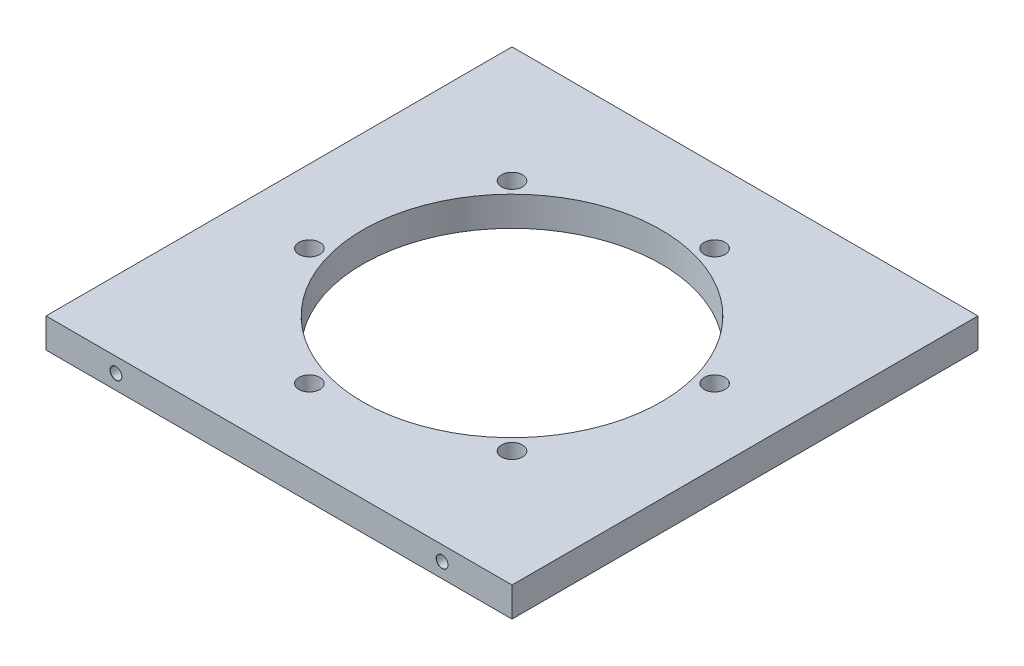
ISO-10303-21;
HEADER;
FILE_DESCRIPTION(('STEP AP214'),'2;1');
FILE_NAME('part.step','',(''),(''),'','','');
FILE_SCHEMA(('AUTOMOTIVE_DESIGN { 1 0 10303 214 1 1 1 1 }'));
ENDSEC;
DATA;
#1=APPLICATION_CONTEXT('core data for automotive mechanical design processes');
#2=APPLICATION_PROTOCOL_DEFINITION('international standard','automotive_design',2000,#1);
#3=PRODUCT_CONTEXT('',#1,'mechanical');
#4=PRODUCT('Part','Part','',(#3));
#5=PRODUCT_RELATED_PRODUCT_CATEGORY('part','',(#4));
#6=PRODUCT_DEFINITION_FORMATION('','',#4);
#7=PRODUCT_DEFINITION_CONTEXT('part definition',#1,'design');
#8=PRODUCT_DEFINITION('design','',#6,#7);
#9=PRODUCT_DEFINITION_SHAPE('','',#8);
#10=(LENGTH_UNIT() NAMED_UNIT(*) SI_UNIT(.MILLI.,.METRE.));
#11=(NAMED_UNIT(*) PLANE_ANGLE_UNIT() SI_UNIT($,.RADIAN.));
#12=(NAMED_UNIT(*) SI_UNIT($,.STERADIAN.) SOLID_ANGLE_UNIT());
#13=UNCERTAINTY_MEASURE_WITH_UNIT(LENGTH_MEASURE(1.E-05),#10,'distance_accuracy_value','');
#14=(GEOMETRIC_REPRESENTATION_CONTEXT(3) GLOBAL_UNCERTAINTY_ASSIGNED_CONTEXT((#13)) GLOBAL_UNIT_ASSIGNED_CONTEXT((#10,
#11,#12)) REPRESENTATION_CONTEXT('',''));
#15=CARTESIAN_POINT('',(0.,0.,0.));
#16=DIRECTION('',(0.,0.,1.));
#17=DIRECTION('',(1.,0.,0.));
#18=AXIS2_PLACEMENT_3D('',#15,#16,#17);
#19=CARTESIAN_POINT('',(0.,6.35,50.));
#20=DIRECTION('',(0.,0.,-1.));
#21=DIRECTION('',(-1.,0.,0.));
#22=AXIS2_PLACEMENT_3D('',#19,#20,#21);
#23=PLANE('',#22);
#24=CARTESIAN_POINT('',(-35.,3.175,50.));
#25=DIRECTION('',(0.,0.,1.));
#26=DIRECTION('',(1.,0.,0.));
#27=AXIS2_PLACEMENT_3D('',#24,#25,#26);
#28=CIRCLE('',#27,1.275);
#29=CARTESIAN_POINT('',(-33.725,3.175,50.));
#30=VERTEX_POINT('',#29);
#31=EDGE_CURVE('E129',#30,#30,#28,.T.);
#32=ORIENTED_EDGE('',*,*,#31,.F.);
#33=EDGE_LOOP('',(#32));
#34=FACE_BOUND('',#33,.T.);
#35=CARTESIAN_POINT('',(35.,3.175,50.));
#36=DIRECTION('',(0.,0.,1.));
#37=DIRECTION('',(1.,0.,0.));
#38=AXIS2_PLACEMENT_3D('',#35,#36,#37);
#39=CIRCLE('',#38,1.275);
#40=CARTESIAN_POINT('',(36.275,3.175,50.));
#41=VERTEX_POINT('',#40);
#42=EDGE_CURVE('E141',#41,#41,#39,.T.);
#43=ORIENTED_EDGE('',*,*,#42,.F.);
#44=EDGE_LOOP('',(#43));
#45=FACE_BOUND('',#44,.T.);
#46=DIRECTION('',(1.,0.,0.));
#47=VECTOR('',#46,1.);
#48=CARTESIAN_POINT('',(0.,0.,50.));
#49=LINE('',#48,#47);
#50=CARTESIAN_POINT('',(-50.,0.,50.));
#51=VERTEX_POINT('',#50);
#52=CARTESIAN_POINT('',(50.,0.,50.));
#53=VERTEX_POINT('',#52);
#54=EDGE_CURVE('E225',#51,#53,#49,.T.);
#55=ORIENTED_EDGE('',*,*,#54,.T.);
#56=DIRECTION('',(0.,-1.,0.));
#57=VECTOR('',#56,1.);
#58=CARTESIAN_POINT('',(50.,6.35,50.));
#59=LINE('',#58,#57);
#60=CARTESIAN_POINT('',(50.,6.35,50.));
#61=VERTEX_POINT('',#60);
#62=EDGE_CURVE('E11',#61,#53,#59,.T.);
#63=ORIENTED_EDGE('',*,*,#62,.F.);
#64=DIRECTION('',(1.,0.,0.));
#65=VECTOR('',#64,1.);
#66=CARTESIAN_POINT('',(0.,6.35,50.));
#67=LINE('',#66,#65);
#68=CARTESIAN_POINT('',(-50.,6.35,50.));
#69=VERTEX_POINT('',#68);
#70=EDGE_CURVE('E226',#69,#61,#67,.T.);
#71=ORIENTED_EDGE('',*,*,#70,.F.);
#72=DIRECTION('',(0.,-1.,0.));
#73=VECTOR('',#72,1.);
#74=CARTESIAN_POINT('',(-50.,6.35,50.));
#75=LINE('',#74,#73);
#76=EDGE_CURVE('E58',#69,#51,#75,.T.);
#77=ORIENTED_EDGE('',*,*,#76,.T.);
#78=EDGE_LOOP('',(#55,#63,#71,#77));
#79=FACE_BOUND('',#78,.T.);
#80=ADVANCED_FACE('F41',(#34,#45,#79),#23,.F.);
#81=CARTESIAN_POINT('',(50.,6.35,0.));
#82=DIRECTION('',(-1.,0.,0.));
#83=DIRECTION('',(0.,0.,1.));
#84=AXIS2_PLACEMENT_3D('',#81,#82,#83);
#85=PLANE('',#84);
#86=DIRECTION('',(0.,0.,-1.));
#87=VECTOR('',#86,1.);
#88=CARTESIAN_POINT('',(50.,0.,0.));
#89=LINE('',#88,#87);
#90=CARTESIAN_POINT('',(50.,0.,-50.));
#91=VERTEX_POINT('',#90);
#92=EDGE_CURVE('E245',#53,#91,#89,.T.);
#93=ORIENTED_EDGE('',*,*,#92,.T.);
#94=DIRECTION('',(0.,-1.,0.));
#95=VECTOR('',#94,1.);
#96=CARTESIAN_POINT('',(50.,6.35,-50.));
#97=LINE('',#96,#95);
#98=CARTESIAN_POINT('',(50.,6.35,-50.));
#99=VERTEX_POINT('',#98);
#100=EDGE_CURVE('E50',#99,#91,#97,.T.);
#101=ORIENTED_EDGE('',*,*,#100,.F.);
#102=DIRECTION('',(0.,0.,-1.));
#103=VECTOR('',#102,1.);
#104=CARTESIAN_POINT('',(50.,6.35,0.));
#105=LINE('',#104,#103);
#106=EDGE_CURVE('E84',#61,#99,#105,.T.);
#107=ORIENTED_EDGE('',*,*,#106,.F.);
#108=ORIENTED_EDGE('',*,*,#62,.T.);
#109=EDGE_LOOP('',(#93,#101,#107,#108));
#110=FACE_BOUND('',#109,.T.);
#111=ADVANCED_FACE('F267',(#110),#85,.F.);
#112=CARTESIAN_POINT('',(0.,6.35,-50.));
#113=DIRECTION('',(0.,0.,-1.));
#114=DIRECTION('',(-1.,0.,0.));
#115=AXIS2_PLACEMENT_3D('',#112,#113,#114);
#116=PLANE('',#115);
#117=CARTESIAN_POINT('',(35.,3.175,-50.));
#118=DIRECTION('',(0.,0.,-1.));
#119=DIRECTION('',(-1.,0.,0.));
#120=AXIS2_PLACEMENT_3D('',#117,#118,#119);
#121=CIRCLE('',#120,1.275);
#122=CARTESIAN_POINT('',(33.725,3.175,-50.));
#123=VERTEX_POINT('',#122);
#124=EDGE_CURVE('E118',#123,#123,#121,.T.);
#125=ORIENTED_EDGE('',*,*,#124,.F.);
#126=EDGE_LOOP('',(#125));
#127=FACE_BOUND('',#126,.T.);
#128=CARTESIAN_POINT('',(-35.,3.175,-50.));
#129=DIRECTION('',(0.,0.,-1.));
#130=DIRECTION('',(-1.,0.,0.));
#131=AXIS2_PLACEMENT_3D('',#128,#129,#130);
#132=CIRCLE('',#131,1.275);
#133=CARTESIAN_POINT('',(-36.275,3.175,-50.));
#134=VERTEX_POINT('',#133);
#135=EDGE_CURVE('E109',#134,#134,#132,.T.);
#136=ORIENTED_EDGE('',*,*,#135,.F.);
#137=EDGE_LOOP('',(#136));
#138=FACE_BOUND('',#137,.T.);
#139=DIRECTION('',(1.,0.,0.));
#140=VECTOR('',#139,1.);
#141=CARTESIAN_POINT('',(0.,0.,-50.));
#142=LINE('',#141,#140);
#143=CARTESIAN_POINT('',(-50.,0.,-50.));
#144=VERTEX_POINT('',#143);
#145=EDGE_CURVE('E249',#144,#91,#142,.T.);
#146=ORIENTED_EDGE('',*,*,#145,.F.);
#147=DIRECTION('',(0.,-1.,0.));
#148=VECTOR('',#147,1.);
#149=CARTESIAN_POINT('',(-50.,6.35,-50.));
#150=LINE('',#149,#148);
#151=CARTESIAN_POINT('',(-50.,6.35,-50.));
#152=VERTEX_POINT('',#151);
#153=EDGE_CURVE('E73',#152,#144,#150,.T.);
#154=ORIENTED_EDGE('',*,*,#153,.F.);
#155=DIRECTION('',(1.,0.,0.));
#156=VECTOR('',#155,1.);
#157=CARTESIAN_POINT('',(0.,6.35,-50.));
#158=LINE('',#157,#156);
#159=EDGE_CURVE('E232',#152,#99,#158,.T.);
#160=ORIENTED_EDGE('',*,*,#159,.T.);
#161=ORIENTED_EDGE('',*,*,#100,.T.);
#162=EDGE_LOOP('',(#146,#154,#160,#161));
#163=FACE_BOUND('',#162,.T.);
#164=ADVANCED_FACE('F265',(#127,#138,#163),#116,.T.);
#165=CARTESIAN_POINT('',(-50.,6.35,0.));
#166=DIRECTION('',(-1.,0.,0.));
#167=DIRECTION('',(0.,0.,1.));
#168=AXIS2_PLACEMENT_3D('',#165,#166,#167);
#169=PLANE('',#168);
#170=DIRECTION('',(0.,0.,-1.));
#171=VECTOR('',#170,1.);
#172=CARTESIAN_POINT('',(-50.,0.,0.));
#173=LINE('',#172,#171);
#174=EDGE_CURVE('E253',#51,#144,#173,.T.);
#175=ORIENTED_EDGE('',*,*,#174,.F.);
#176=ORIENTED_EDGE('',*,*,#76,.F.);
#177=DIRECTION('',(0.,0.,-1.));
#178=VECTOR('',#177,1.);
#179=CARTESIAN_POINT('',(-50.,6.35,0.));
#180=LINE('',#179,#178);
#181=EDGE_CURVE('E236',#69,#152,#180,.T.);
#182=ORIENTED_EDGE('',*,*,#181,.T.);
#183=ORIENTED_EDGE('',*,*,#153,.T.);
#184=EDGE_LOOP('',(#175,#176,#182,#183));
#185=FACE_BOUND('',#184,.T.);
#186=ADVANCED_FACE('F272',(#185),#169,.T.);
#187=CARTESIAN_POINT('',(0.,6.35,0.));
#188=DIRECTION('',(0.,-1.,0.));
#189=DIRECTION('',(0.,0.,-1.));
#190=AXIS2_PLACEMENT_3D('',#187,#188,#189);
#191=CYLINDRICAL_SURFACE('',#190,32.);
#192=CARTESIAN_POINT('',(0.,6.35,0.));
#193=DIRECTION('',(0.,1.,0.));
#194=DIRECTION('',(0.,0.,1.));
#195=AXIS2_PLACEMENT_3D('',#192,#193,#194);
#196=CIRCLE('',#195,32.);
#197=CARTESIAN_POINT('',(0.,6.35,32.));
#198=VERTEX_POINT('',#197);
#199=EDGE_CURVE('E239',#198,#198,#196,.T.);
#200=ORIENTED_EDGE('',*,*,#199,.T.);
#201=EDGE_LOOP('',(#200));
#202=FACE_BOUND('',#201,.T.);
#203=CARTESIAN_POINT('',(0.,0.,0.));
#204=DIRECTION('',(0.,1.,0.));
#205=DIRECTION('',(0.,0.,1.));
#206=AXIS2_PLACEMENT_3D('',#203,#204,#205);
#207=CIRCLE('',#206,32.);
#208=CARTESIAN_POINT('',(0.,0.,32.));
#209=VERTEX_POINT('',#208);
#210=EDGE_CURVE('E229',#209,#209,#207,.T.);
#211=ORIENTED_EDGE('',*,*,#210,.F.);
#212=EDGE_LOOP('',(#211));
#213=FACE_BOUND('',#212,.T.);
#214=ADVANCED_FACE('F274',(#202,#213),#191,.F.);
#215=CARTESIAN_POINT('',(0.,6.35,0.));
#216=DIRECTION('',(0.,1.,0.));
#217=DIRECTION('',(0.,0.,1.));
#218=AXIS2_PLACEMENT_3D('',#215,#216,#217);
#219=PLANE('',#218);
#220=CARTESIAN_POINT('',(9.18807610113908,6.35,-34.290366833262));
#221=DIRECTION('',(0.,-1.,0.));
#222=DIRECTION('',(0.,0.,-1.));
#223=AXIS2_PLACEMENT_3D('',#220,#221,#222);
#224=CIRCLE('',#223,2.25);
#225=CARTESIAN_POINT('',(9.18807610113908,6.35,-36.540366833262));
#226=VERTEX_POINT('',#225);
#227=EDGE_CURVE('E161',#226,#226,#224,.T.);
#228=ORIENTED_EDGE('',*,*,#227,.T.);
#229=EDGE_LOOP('',(#228));
#230=FACE_BOUND('',#229,.T.);
#231=CARTESIAN_POINT('',(-25.1022907321224,6.35,-25.1022907321224));
#232=DIRECTION('',(0.,-1.,0.));
#233=DIRECTION('',(0.,0.,-1.));
#234=AXIS2_PLACEMENT_3D('',#231,#232,#233);
#235=CIRCLE('',#234,2.25);
#236=CARTESIAN_POINT('',(-25.1022907321224,6.35,-27.3522907321224));
#237=VERTEX_POINT('',#236);
#238=EDGE_CURVE('E173',#237,#237,#235,.T.);
#239=ORIENTED_EDGE('',*,*,#238,.T.);
#240=EDGE_LOOP('',(#239));
#241=FACE_BOUND('',#240,.T.);
#242=CARTESIAN_POINT('',(-34.2903668332618,6.35,9.18807610114007));
#243=DIRECTION('',(0.,-1.,0.));
#244=DIRECTION('',(0.,0.,-1.));
#245=AXIS2_PLACEMENT_3D('',#242,#243,#244);
#246=CIRCLE('',#245,2.25);
#247=CARTESIAN_POINT('',(-34.2903668332618,6.35,6.93807610114007));
#248=VERTEX_POINT('',#247);
#249=EDGE_CURVE('E185',#248,#248,#246,.T.);
#250=ORIENTED_EDGE('',*,*,#249,.T.);
#251=EDGE_LOOP('',(#250));
#252=FACE_BOUND('',#251,.T.);
#253=CARTESIAN_POINT('',(-9.18807610113931,6.35,34.290366833262));
#254=DIRECTION('',(0.,-1.,0.));
#255=DIRECTION('',(0.,0.,-1.));
#256=AXIS2_PLACEMENT_3D('',#253,#254,#255);
#257=CIRCLE('',#256,2.25);
#258=CARTESIAN_POINT('',(-9.18807610113931,6.35,32.040366833262));
#259=VERTEX_POINT('',#258);
#260=EDGE_CURVE('E197',#259,#259,#257,.T.);
#261=ORIENTED_EDGE('',*,*,#260,.T.);
#262=EDGE_LOOP('',(#261));
#263=FACE_BOUND('',#262,.T.);
#264=CARTESIAN_POINT('',(25.1022907321224,6.35,25.1022907321224));
#265=DIRECTION('',(0.,-1.,0.));
#266=DIRECTION('',(0.,0.,-1.));
#267=AXIS2_PLACEMENT_3D('',#264,#265,#266);
#268=CIRCLE('',#267,2.25);
#269=CARTESIAN_POINT('',(25.1022907321224,6.35,22.8522907321224));
#270=VERTEX_POINT('',#269);
#271=EDGE_CURVE('E209',#270,#270,#268,.T.);
#272=ORIENTED_EDGE('',*,*,#271,.T.);
#273=EDGE_LOOP('',(#272));
#274=FACE_BOUND('',#273,.T.);
#275=CARTESIAN_POINT('',(34.2903668332619,6.35,-9.18807610113958));
#276=DIRECTION('',(0.,-1.,0.));
#277=DIRECTION('',(0.,0.,-1.));
#278=AXIS2_PLACEMENT_3D('',#275,#276,#277);
#279=CIRCLE('',#278,2.25);
#280=CARTESIAN_POINT('',(34.2903668332619,6.35,-11.4380761011396));
#281=VERTEX_POINT('',#280);
#282=EDGE_CURVE('E221',#281,#281,#279,.T.);
#283=ORIENTED_EDGE('',*,*,#282,.T.);
#284=EDGE_LOOP('',(#283));
#285=FACE_BOUND('',#284,.T.);
#286=ORIENTED_EDGE('',*,*,#70,.T.);
#287=ORIENTED_EDGE('',*,*,#106,.T.);
#288=ORIENTED_EDGE('',*,*,#159,.F.);
#289=ORIENTED_EDGE('',*,*,#181,.F.);
#290=EDGE_LOOP('',(#286,#287,#288,#289));
#291=FACE_BOUND('',#290,.T.);
#292=ORIENTED_EDGE('',*,*,#199,.F.);
#293=EDGE_LOOP('',(#292));
#294=FACE_BOUND('',#293,.T.);
#295=ADVANCED_FACE('F280',(#230,#241,#252,#263,#274,#285,#291,#294),#219,.T.);
#296=CARTESIAN_POINT('',(0.,0.,0.));
#297=DIRECTION('',(0.,1.,0.));
#298=DIRECTION('',(0.,0.,1.));
#299=AXIS2_PLACEMENT_3D('',#296,#297,#298);
#300=PLANE('',#299);
#301=CARTESIAN_POINT('',(9.18807610113908,0.,-34.290366833262));
#302=DIRECTION('',(0.,-1.,0.));
#303=DIRECTION('',(0.,0.,-1.));
#304=AXIS2_PLACEMENT_3D('',#301,#302,#303);
#305=CIRCLE('',#304,2.275);
#306=CARTESIAN_POINT('',(9.18807610113908,0.,-36.565366833262));
#307=VERTEX_POINT('',#306);
#308=EDGE_CURVE('E153',#307,#307,#305,.T.);
#309=ORIENTED_EDGE('',*,*,#308,.F.);
#310=EDGE_LOOP('',(#309));
#311=FACE_BOUND('',#310,.T.);
#312=CARTESIAN_POINT('',(-25.1022907321224,0.,-25.1022907321224));
#313=DIRECTION('',(0.,-1.,0.));
#314=DIRECTION('',(0.,0.,-1.));
#315=AXIS2_PLACEMENT_3D('',#312,#313,#314);
#316=CIRCLE('',#315,2.275);
#317=CARTESIAN_POINT('',(-25.1022907321224,0.,-27.3772907321224));
#318=VERTEX_POINT('',#317);
#319=EDGE_CURVE('E165',#318,#318,#316,.T.);
#320=ORIENTED_EDGE('',*,*,#319,.F.);
#321=EDGE_LOOP('',(#320));
#322=FACE_BOUND('',#321,.T.);
#323=CARTESIAN_POINT('',(-34.2903668332618,0.,9.18807610114007));
#324=DIRECTION('',(0.,-1.,0.));
#325=DIRECTION('',(0.,0.,-1.));
#326=AXIS2_PLACEMENT_3D('',#323,#324,#325);
#327=CIRCLE('',#326,2.275);
#328=CARTESIAN_POINT('',(-34.2903668332618,0.,6.91307610114007));
#329=VERTEX_POINT('',#328);
#330=EDGE_CURVE('E177',#329,#329,#327,.T.);
#331=ORIENTED_EDGE('',*,*,#330,.F.);
#332=EDGE_LOOP('',(#331));
#333=FACE_BOUND('',#332,.T.);
#334=CARTESIAN_POINT('',(-9.18807610113931,0.,34.290366833262));
#335=DIRECTION('',(0.,-1.,0.));
#336=DIRECTION('',(0.,0.,-1.));
#337=AXIS2_PLACEMENT_3D('',#334,#335,#336);
#338=CIRCLE('',#337,2.275);
#339=CARTESIAN_POINT('',(-9.18807610113931,0.,32.015366833262));
#340=VERTEX_POINT('',#339);
#341=EDGE_CURVE('E189',#340,#340,#338,.T.);
#342=ORIENTED_EDGE('',*,*,#341,.F.);
#343=EDGE_LOOP('',(#342));
#344=FACE_BOUND('',#343,.T.);
#345=CARTESIAN_POINT('',(25.1022907321224,0.,25.1022907321224));
#346=DIRECTION('',(0.,-1.,0.));
#347=DIRECTION('',(0.,0.,-1.));
#348=AXIS2_PLACEMENT_3D('',#345,#346,#347);
#349=CIRCLE('',#348,2.275);
#350=CARTESIAN_POINT('',(25.1022907321224,0.,22.8272907321224));
#351=VERTEX_POINT('',#350);
#352=EDGE_CURVE('E201',#351,#351,#349,.T.);
#353=ORIENTED_EDGE('',*,*,#352,.F.);
#354=EDGE_LOOP('',(#353));
#355=FACE_BOUND('',#354,.T.);
#356=CARTESIAN_POINT('',(34.2903668332619,0.,-9.18807610113958));
#357=DIRECTION('',(0.,-1.,0.));
#358=DIRECTION('',(0.,0.,-1.));
#359=AXIS2_PLACEMENT_3D('',#356,#357,#358);
#360=CIRCLE('',#359,2.275);
#361=CARTESIAN_POINT('',(34.2903668332619,0.,-11.4630761011396));
#362=VERTEX_POINT('',#361);
#363=EDGE_CURVE('E213',#362,#362,#360,.T.);
#364=ORIENTED_EDGE('',*,*,#363,.F.);
#365=EDGE_LOOP('',(#364));
#366=FACE_BOUND('',#365,.T.);
#367=ORIENTED_EDGE('',*,*,#54,.F.);
#368=ORIENTED_EDGE('',*,*,#174,.T.);
#369=ORIENTED_EDGE('',*,*,#145,.T.);
#370=ORIENTED_EDGE('',*,*,#92,.F.);
#371=EDGE_LOOP('',(#367,#368,#369,#370));
#372=FACE_BOUND('',#371,.T.);
#373=ORIENTED_EDGE('',*,*,#210,.T.);
#374=EDGE_LOOP('',(#373));
#375=FACE_BOUND('',#374,.T.);
#376=ADVANCED_FACE('F270',(#311,#322,#333,#344,#355,#366,#372,#375),#300,.F.);
#377=CARTESIAN_POINT('',(34.2903668332619,0.,-9.18807610113958));
#378=DIRECTION('',(0.,-1.,0.));
#379=DIRECTION('',(0.,0.,-1.));
#380=AXIS2_PLACEMENT_3D('',#377,#378,#379);
#381=CYLINDRICAL_SURFACE('',#380,2.25);
#382=ORIENTED_EDGE('',*,*,#282,.F.);
#383=EDGE_LOOP('',(#382));
#384=FACE_BOUND('',#383,.T.);
#385=CARTESIAN_POINT('',(34.2903668332619,0.0249999999999972,-9.18807610113958));
#386=DIRECTION('',(0.,-1.,0.));
#387=DIRECTION('',(0.,0.,-1.));
#388=AXIS2_PLACEMENT_3D('',#385,#386,#387);
#389=CIRCLE('',#388,2.24999999999999);
#390=CARTESIAN_POINT('',(34.2903668332619,0.0249999999999972,-11.4380761011396));
#391=VERTEX_POINT('',#390);
#392=EDGE_CURVE('E217',#391,#391,#389,.T.);
#393=ORIENTED_EDGE('',*,*,#392,.T.);
#394=EDGE_LOOP('',(#393));
#395=FACE_BOUND('',#394,.T.);
#396=ADVANCED_FACE('F303',(#384,#395),#381,.F.);
#397=CARTESIAN_POINT('',(34.2903668332619,0.,-9.18807610113958));
#398=DIRECTION('',(0.,-1.,0.));
#399=DIRECTION('',(0.,0.,-1.));
#400=AXIS2_PLACEMENT_3D('',#397,#398,#399);
#401=CONICAL_SURFACE('',#400,2.275,0.785398163397691);
#402=ORIENTED_EDGE('',*,*,#392,.F.);
#403=EDGE_LOOP('',(#402));
#404=FACE_BOUND('',#403,.T.);
#405=ORIENTED_EDGE('',*,*,#363,.T.);
#406=EDGE_LOOP('',(#405));
#407=FACE_BOUND('',#406,.T.);
#408=ADVANCED_FACE('F309',(#404,#407),#401,.F.);
#409=CARTESIAN_POINT('',(25.1022907321224,0.,25.1022907321224));
#410=DIRECTION('',(0.,-1.,0.));
#411=DIRECTION('',(0.,0.,-1.));
#412=AXIS2_PLACEMENT_3D('',#409,#410,#411);
#413=CYLINDRICAL_SURFACE('',#412,2.24999999999999);
#414=ORIENTED_EDGE('',*,*,#271,.F.);
#415=EDGE_LOOP('',(#414));
#416=FACE_BOUND('',#415,.T.);
#417=CARTESIAN_POINT('',(25.1022907321224,0.0249999999999972,25.1022907321224));
#418=DIRECTION('',(0.,-1.,0.));
#419=DIRECTION('',(0.,0.,-1.));
#420=AXIS2_PLACEMENT_3D('',#417,#418,#419);
#421=CIRCLE('',#420,2.24999999999999);
#422=CARTESIAN_POINT('',(25.1022907321224,0.0249999999999972,22.8522907321224));
#423=VERTEX_POINT('',#422);
#424=EDGE_CURVE('E205',#423,#423,#421,.T.);
#425=ORIENTED_EDGE('',*,*,#424,.T.);
#426=EDGE_LOOP('',(#425));
#427=FACE_BOUND('',#426,.T.);
#428=ADVANCED_FACE('F317',(#416,#427),#413,.F.);
#429=CARTESIAN_POINT('',(25.1022907321224,0.,25.1022907321224));
#430=DIRECTION('',(0.,-1.,0.));
#431=DIRECTION('',(0.,0.,-1.));
#432=AXIS2_PLACEMENT_3D('',#429,#430,#431);
#433=CONICAL_SURFACE('',#432,2.275,0.785398163397691);
#434=ORIENTED_EDGE('',*,*,#424,.F.);
#435=EDGE_LOOP('',(#434));
#436=FACE_BOUND('',#435,.T.);
#437=ORIENTED_EDGE('',*,*,#352,.T.);
#438=EDGE_LOOP('',(#437));
#439=FACE_BOUND('',#438,.T.);
#440=ADVANCED_FACE('F321',(#436,#439),#433,.F.);
#441=CARTESIAN_POINT('',(-9.18807610113931,0.,34.290366833262));
#442=DIRECTION('',(0.,-1.,0.));
#443=DIRECTION('',(0.,0.,-1.));
#444=AXIS2_PLACEMENT_3D('',#441,#442,#443);
#445=CYLINDRICAL_SURFACE('',#444,2.24999999999999);
#446=ORIENTED_EDGE('',*,*,#260,.F.);
#447=EDGE_LOOP('',(#446));
#448=FACE_BOUND('',#447,.T.);
#449=CARTESIAN_POINT('',(-9.18807610113931,0.0249999999999972,34.290366833262));
#450=DIRECTION('',(0.,-1.,0.));
#451=DIRECTION('',(0.,0.,-1.));
#452=AXIS2_PLACEMENT_3D('',#449,#450,#451);
#453=CIRCLE('',#452,2.24999999999999);
#454=CARTESIAN_POINT('',(-9.18807610113931,0.0249999999999972,32.040366833262));
#455=VERTEX_POINT('',#454);
#456=EDGE_CURVE('E193',#455,#455,#453,.T.);
#457=ORIENTED_EDGE('',*,*,#456,.T.);
#458=EDGE_LOOP('',(#457));
#459=FACE_BOUND('',#458,.T.);
#460=ADVANCED_FACE('F325',(#448,#459),#445,.F.);
#461=CARTESIAN_POINT('',(-9.18807610113931,0.,34.290366833262));
#462=DIRECTION('',(0.,-1.,0.));
#463=DIRECTION('',(0.,0.,-1.));
#464=AXIS2_PLACEMENT_3D('',#461,#462,#463);
#465=CONICAL_SURFACE('',#464,2.275,0.785398163397691);
#466=ORIENTED_EDGE('',*,*,#456,.F.);
#467=EDGE_LOOP('',(#466));
#468=FACE_BOUND('',#467,.T.);
#469=ORIENTED_EDGE('',*,*,#341,.T.);
#470=EDGE_LOOP('',(#469));
#471=FACE_BOUND('',#470,.T.);
#472=ADVANCED_FACE('F329',(#468,#471),#465,.F.);
#473=CARTESIAN_POINT('',(-34.2903668332618,0.,9.18807610114007));
#474=DIRECTION('',(0.,-1.,0.));
#475=DIRECTION('',(0.,0.,-1.));
#476=AXIS2_PLACEMENT_3D('',#473,#474,#475);
#477=CYLINDRICAL_SURFACE('',#476,2.25);
#478=ORIENTED_EDGE('',*,*,#249,.F.);
#479=EDGE_LOOP('',(#478));
#480=FACE_BOUND('',#479,.T.);
#481=CARTESIAN_POINT('',(-34.2903668332618,0.0249999999999972,9.18807610114007));
#482=DIRECTION('',(0.,-1.,0.));
#483=DIRECTION('',(0.,0.,-1.));
#484=AXIS2_PLACEMENT_3D('',#481,#482,#483);
#485=CIRCLE('',#484,2.24999999999999);
#486=CARTESIAN_POINT('',(-34.2903668332618,0.0249999999999972,6.93807610114008));
#487=VERTEX_POINT('',#486);
#488=EDGE_CURVE('E181',#487,#487,#485,.T.);
#489=ORIENTED_EDGE('',*,*,#488,.T.);
#490=EDGE_LOOP('',(#489));
#491=FACE_BOUND('',#490,.T.);
#492=ADVANCED_FACE('F333',(#480,#491),#477,.F.);
#493=CARTESIAN_POINT('',(-34.2903668332618,0.,9.18807610114007));
#494=DIRECTION('',(0.,-1.,0.));
#495=DIRECTION('',(0.,0.,-1.));
#496=AXIS2_PLACEMENT_3D('',#493,#494,#495);
#497=CONICAL_SURFACE('',#496,2.275,0.785398163397691);
#498=ORIENTED_EDGE('',*,*,#488,.F.);
#499=EDGE_LOOP('',(#498));
#500=FACE_BOUND('',#499,.T.);
#501=ORIENTED_EDGE('',*,*,#330,.T.);
#502=EDGE_LOOP('',(#501));
#503=FACE_BOUND('',#502,.T.);
#504=ADVANCED_FACE('F337',(#500,#503),#497,.F.);
#505=CARTESIAN_POINT('',(-25.1022907321224,0.,-25.1022907321224));
#506=DIRECTION('',(0.,-1.,0.));
#507=DIRECTION('',(0.,0.,-1.));
#508=AXIS2_PLACEMENT_3D('',#505,#506,#507);
#509=CYLINDRICAL_SURFACE('',#508,2.24999999999999);
#510=ORIENTED_EDGE('',*,*,#238,.F.);
#511=EDGE_LOOP('',(#510));
#512=FACE_BOUND('',#511,.T.);
#513=CARTESIAN_POINT('',(-25.1022907321224,0.0249999999999972,-25.1022907321224));
#514=DIRECTION('',(0.,-1.,0.));
#515=DIRECTION('',(0.,0.,-1.));
#516=AXIS2_PLACEMENT_3D('',#513,#514,#515);
#517=CIRCLE('',#516,2.24999999999999);
#518=CARTESIAN_POINT('',(-25.1022907321224,0.0249999999999972,-27.3522907321224));
#519=VERTEX_POINT('',#518);
#520=EDGE_CURVE('E169',#519,#519,#517,.T.);
#521=ORIENTED_EDGE('',*,*,#520,.T.);
#522=EDGE_LOOP('',(#521));
#523=FACE_BOUND('',#522,.T.);
#524=ADVANCED_FACE('F341',(#512,#523),#509,.F.);
#525=CARTESIAN_POINT('',(-25.1022907321224,0.,-25.1022907321224));
#526=DIRECTION('',(0.,-1.,0.));
#527=DIRECTION('',(0.,0.,-1.));
#528=AXIS2_PLACEMENT_3D('',#525,#526,#527);
#529=CONICAL_SURFACE('',#528,2.275,0.785398163397691);
#530=ORIENTED_EDGE('',*,*,#520,.F.);
#531=EDGE_LOOP('',(#530));
#532=FACE_BOUND('',#531,.T.);
#533=ORIENTED_EDGE('',*,*,#319,.T.);
#534=EDGE_LOOP('',(#533));
#535=FACE_BOUND('',#534,.T.);
#536=ADVANCED_FACE('F345',(#532,#535),#529,.F.);
#537=CARTESIAN_POINT('',(9.18807610113908,0.,-34.290366833262));
#538=DIRECTION('',(0.,-1.,0.));
#539=DIRECTION('',(0.,0.,-1.));
#540=AXIS2_PLACEMENT_3D('',#537,#538,#539);
#541=CYLINDRICAL_SURFACE('',#540,2.24999999999999);
#542=ORIENTED_EDGE('',*,*,#227,.F.);
#543=EDGE_LOOP('',(#542));
#544=FACE_BOUND('',#543,.T.);
#545=CARTESIAN_POINT('',(9.18807610113908,0.0249999999999972,-34.290366833262));
#546=DIRECTION('',(0.,-1.,0.));
#547=DIRECTION('',(0.,0.,-1.));
#548=AXIS2_PLACEMENT_3D('',#545,#546,#547);
#549=CIRCLE('',#548,2.24999999999999);
#550=CARTESIAN_POINT('',(9.18807610113908,0.0249999999999972,-36.540366833262));
#551=VERTEX_POINT('',#550);
#552=EDGE_CURVE('E157',#551,#551,#549,.T.);
#553=ORIENTED_EDGE('',*,*,#552,.T.);
#554=EDGE_LOOP('',(#553));
#555=FACE_BOUND('',#554,.T.);
#556=ADVANCED_FACE('F349',(#544,#555),#541,.F.);
#557=CARTESIAN_POINT('',(9.18807610113908,0.,-34.290366833262));
#558=DIRECTION('',(0.,-1.,0.));
#559=DIRECTION('',(0.,0.,-1.));
#560=AXIS2_PLACEMENT_3D('',#557,#558,#559);
#561=CONICAL_SURFACE('',#560,2.275,0.785398163397691);
#562=ORIENTED_EDGE('',*,*,#552,.F.);
#563=EDGE_LOOP('',(#562));
#564=FACE_BOUND('',#563,.T.);
#565=ORIENTED_EDGE('',*,*,#308,.T.);
#566=EDGE_LOOP('',(#565));
#567=FACE_BOUND('',#566,.T.);
#568=ADVANCED_FACE('F353',(#564,#567),#561,.F.);
#569=CARTESIAN_POINT('',(35.,3.175,40.7510757737845));
#570=DIRECTION('',(0.,0.,1.));
#571=DIRECTION('',(1.,0.,0.));
#572=AXIS2_PLACEMENT_3D('',#569,#570,#571);
#573=CONICAL_SURFACE('',#572,1.24999999999999,1.02974425867665);
#574=CARTESIAN_POINT('',(35.,3.175,40.));
#575=VERTEX_POINT('',#574);
#576=VERTEX_LOOP('',#575);
#577=FACE_BOUND('',#576,.T.);
#578=CARTESIAN_POINT('',(35.,3.175,40.7510757737845));
#579=DIRECTION('',(0.,0.,1.));
#580=DIRECTION('',(1.,0.,0.));
#581=AXIS2_PLACEMENT_3D('',#578,#579,#580);
#582=CIRCLE('',#581,1.24999999999999);
#583=CARTESIAN_POINT('',(36.25,3.175,40.7510757737845));
#584=VERTEX_POINT('',#583);
#585=EDGE_CURVE('E149',#584,#584,#582,.T.);
#586=ORIENTED_EDGE('',*,*,#585,.T.);
#587=EDGE_LOOP('',(#586));
#588=FACE_BOUND('',#587,.T.);
#589=ADVANCED_FACE('F357',(#577,#588),#573,.F.);
#590=CARTESIAN_POINT('',(35.,3.175,50.));
#591=DIRECTION('',(0.,0.,1.));
#592=DIRECTION('',(1.,0.,0.));
#593=AXIS2_PLACEMENT_3D('',#590,#591,#592);
#594=CYLINDRICAL_SURFACE('',#593,1.25);
#595=ORIENTED_EDGE('',*,*,#585,.F.);
#596=EDGE_LOOP('',(#595));
#597=FACE_BOUND('',#596,.T.);
#598=CARTESIAN_POINT('',(35.,3.175,49.975));
#599=DIRECTION('',(0.,0.,1.));
#600=DIRECTION('',(1.,0.,0.));
#601=AXIS2_PLACEMENT_3D('',#598,#599,#600);
#602=CIRCLE('',#601,1.25);
#603=CARTESIAN_POINT('',(36.25,3.175,49.975));
#604=VERTEX_POINT('',#603);
#605=EDGE_CURVE('E145',#604,#604,#602,.T.);
#606=ORIENTED_EDGE('',*,*,#605,.T.);
#607=EDGE_LOOP('',(#606));
#608=FACE_BOUND('',#607,.T.);
#609=ADVANCED_FACE('F361',(#597,#608),#594,.F.);
#610=CARTESIAN_POINT('',(35.,3.175,50.));
#611=DIRECTION('',(0.,0.,1.));
#612=DIRECTION('',(1.,0.,0.));
#613=AXIS2_PLACEMENT_3D('',#610,#611,#612);
#614=CONICAL_SURFACE('',#613,1.275,0.785398163397448);
#615=ORIENTED_EDGE('',*,*,#605,.F.);
#616=EDGE_LOOP('',(#615));
#617=FACE_BOUND('',#616,.T.);
#618=ORIENTED_EDGE('',*,*,#42,.T.);
#619=EDGE_LOOP('',(#618));
#620=FACE_BOUND('',#619,.T.);
#621=ADVANCED_FACE('F365',(#617,#620),#614,.F.);
#622=CARTESIAN_POINT('',(-35.,3.175,40.7510757737845));
#623=DIRECTION('',(0.,0.,1.));
#624=DIRECTION('',(1.,0.,0.));
#625=AXIS2_PLACEMENT_3D('',#622,#623,#624);
#626=CONICAL_SURFACE('',#625,1.24999999999999,1.02974425867665);
#627=CARTESIAN_POINT('',(-35.,3.175,40.));
#628=VERTEX_POINT('',#627);
#629=VERTEX_LOOP('',#628);
#630=FACE_BOUND('',#629,.T.);
#631=CARTESIAN_POINT('',(-35.,3.175,40.7510757737845));
#632=DIRECTION('',(0.,0.,1.));
#633=DIRECTION('',(1.,0.,0.));
#634=AXIS2_PLACEMENT_3D('',#631,#632,#633);
#635=CIRCLE('',#634,1.24999999999999);
#636=CARTESIAN_POINT('',(-33.75,3.175,40.7510757737845));
#637=VERTEX_POINT('',#636);
#638=EDGE_CURVE('E137',#637,#637,#635,.T.);
#639=ORIENTED_EDGE('',*,*,#638,.T.);
#640=EDGE_LOOP('',(#639));
#641=FACE_BOUND('',#640,.T.);
#642=ADVANCED_FACE('F369',(#630,#641),#626,.F.);
#643=CARTESIAN_POINT('',(-35.,3.175,50.));
#644=DIRECTION('',(0.,0.,1.));
#645=DIRECTION('',(1.,0.,0.));
#646=AXIS2_PLACEMENT_3D('',#643,#644,#645);
#647=CYLINDRICAL_SURFACE('',#646,1.25);
#648=ORIENTED_EDGE('',*,*,#638,.F.);
#649=EDGE_LOOP('',(#648));
#650=FACE_BOUND('',#649,.T.);
#651=CARTESIAN_POINT('',(-35.,3.175,49.975));
#652=DIRECTION('',(0.,0.,1.));
#653=DIRECTION('',(1.,0.,0.));
#654=AXIS2_PLACEMENT_3D('',#651,#652,#653);
#655=CIRCLE('',#654,1.25);
#656=CARTESIAN_POINT('',(-33.75,3.175,49.975));
#657=VERTEX_POINT('',#656);
#658=EDGE_CURVE('E133',#657,#657,#655,.T.);
#659=ORIENTED_EDGE('',*,*,#658,.T.);
#660=EDGE_LOOP('',(#659));
#661=FACE_BOUND('',#660,.T.);
#662=ADVANCED_FACE('F373',(#650,#661),#647,.F.);
#663=CARTESIAN_POINT('',(-35.,3.175,50.));
#664=DIRECTION('',(0.,0.,1.));
#665=DIRECTION('',(1.,0.,0.));
#666=AXIS2_PLACEMENT_3D('',#663,#664,#665);
#667=CONICAL_SURFACE('',#666,1.275,0.785398163397448);
#668=ORIENTED_EDGE('',*,*,#658,.F.);
#669=EDGE_LOOP('',(#668));
#670=FACE_BOUND('',#669,.T.);
#671=ORIENTED_EDGE('',*,*,#31,.T.);
#672=EDGE_LOOP('',(#671));
#673=FACE_BOUND('',#672,.T.);
#674=ADVANCED_FACE('F377',(#670,#673),#667,.F.);
#675=CARTESIAN_POINT('',(-35.,3.175,-40.7510757737845));
#676=DIRECTION('',(0.,0.,-1.));
#677=DIRECTION('',(-1.,0.,0.));
#678=AXIS2_PLACEMENT_3D('',#675,#676,#677);
#679=CONICAL_SURFACE('',#678,1.25,1.02974425867666);
#680=CARTESIAN_POINT('',(-35.,3.175,-40.));
#681=VERTEX_POINT('',#680);
#682=VERTEX_LOOP('',#681);
#683=FACE_BOUND('',#682,.T.);
#684=CARTESIAN_POINT('',(-35.,3.175,-40.7510757737845));
#685=DIRECTION('',(0.,0.,-1.));
#686=DIRECTION('',(-1.,0.,0.));
#687=AXIS2_PLACEMENT_3D('',#684,#685,#686);
#688=CIRCLE('',#687,1.25);
#689=CARTESIAN_POINT('',(-36.25,3.175,-40.7510757737845));
#690=VERTEX_POINT('',#689);
#691=EDGE_CURVE('E125',#690,#690,#688,.T.);
#692=ORIENTED_EDGE('',*,*,#691,.T.);
#693=EDGE_LOOP('',(#692));
#694=FACE_BOUND('',#693,.T.);
#695=ADVANCED_FACE('F381',(#683,#694),#679,.F.);
#696=CARTESIAN_POINT('',(-35.,3.175,-50.));
#697=DIRECTION('',(0.,0.,-1.));
#698=DIRECTION('',(-1.,0.,0.));
#699=AXIS2_PLACEMENT_3D('',#696,#697,#698);
#700=CYLINDRICAL_SURFACE('',#699,1.24999999999999);
#701=ORIENTED_EDGE('',*,*,#691,.F.);
#702=EDGE_LOOP('',(#701));
#703=FACE_BOUND('',#702,.T.);
#704=CARTESIAN_POINT('',(-35.,3.175,-49.975));
#705=DIRECTION('',(0.,0.,-1.));
#706=DIRECTION('',(-1.,0.,0.));
#707=AXIS2_PLACEMENT_3D('',#704,#705,#706);
#708=CIRCLE('',#707,1.24999999999999);
#709=CARTESIAN_POINT('',(-36.25,3.175,-49.975));
#710=VERTEX_POINT('',#709);
#711=EDGE_CURVE('E115',#710,#710,#708,.T.);
#712=ORIENTED_EDGE('',*,*,#711,.T.);
#713=EDGE_LOOP('',(#712));
#714=FACE_BOUND('',#713,.T.);
#715=ADVANCED_FACE('F385',(#703,#714),#700,.F.);
#716=CARTESIAN_POINT('',(-35.,3.175,-50.));
#717=DIRECTION('',(0.,0.,-1.));
#718=DIRECTION('',(-1.,0.,0.));
#719=AXIS2_PLACEMENT_3D('',#716,#717,#718);
#720=CONICAL_SURFACE('',#719,1.275,0.785398163398003);
#721=ORIENTED_EDGE('',*,*,#711,.F.);
#722=EDGE_LOOP('',(#721));
#723=FACE_BOUND('',#722,.T.);
#724=ORIENTED_EDGE('',*,*,#135,.T.);
#725=EDGE_LOOP('',(#724));
#726=FACE_BOUND('',#725,.T.);
#727=ADVANCED_FACE('F102',(#723,#726),#720,.F.);
#728=CARTESIAN_POINT('',(35.,3.175,-40.7510757737845));
#729=DIRECTION('',(0.,0.,-1.));
#730=DIRECTION('',(-1.,0.,0.));
#731=AXIS2_PLACEMENT_3D('',#728,#729,#730);
#732=CONICAL_SURFACE('',#731,1.25,1.02974425867666);
#733=CARTESIAN_POINT('',(35.,3.175,-40.));
#734=VERTEX_POINT('',#733);
#735=VERTEX_LOOP('',#734);
#736=FACE_BOUND('',#735,.T.);
#737=CARTESIAN_POINT('',(35.,3.175,-40.7510757737845));
#738=DIRECTION('',(0.,0.,-1.));
#739=DIRECTION('',(-1.,0.,0.));
#740=AXIS2_PLACEMENT_3D('',#737,#738,#739);
#741=CIRCLE('',#740,1.25);
#742=CARTESIAN_POINT('',(33.75,3.175,-40.7510757737845));
#743=VERTEX_POINT('',#742);
#744=EDGE_CURVE('E106',#743,#743,#741,.T.);
#745=ORIENTED_EDGE('',*,*,#744,.T.);
#746=EDGE_LOOP('',(#745));
#747=FACE_BOUND('',#746,.T.);
#748=ADVANCED_FACE('F98',(#736,#747),#732,.F.);
#749=CARTESIAN_POINT('',(35.,3.175,-50.));
#750=DIRECTION('',(0.,0.,-1.));
#751=DIRECTION('',(-1.,0.,0.));
#752=AXIS2_PLACEMENT_3D('',#749,#750,#751);
#753=CYLINDRICAL_SURFACE('',#752,1.24999999999999);
#754=ORIENTED_EDGE('',*,*,#744,.F.);
#755=EDGE_LOOP('',(#754));
#756=FACE_BOUND('',#755,.T.);
#757=CARTESIAN_POINT('',(35.,3.175,-49.975));
#758=DIRECTION('',(0.,0.,-1.));
#759=DIRECTION('',(-1.,0.,0.));
#760=AXIS2_PLACEMENT_3D('',#757,#758,#759);
#761=CIRCLE('',#760,1.24999999999999);
#762=CARTESIAN_POINT('',(33.75,3.175,-49.975));
#763=VERTEX_POINT('',#762);
#764=EDGE_CURVE('E110',#763,#763,#761,.T.);
#765=ORIENTED_EDGE('',*,*,#764,.T.);
#766=EDGE_LOOP('',(#765));
#767=FACE_BOUND('',#766,.T.);
#768=ADVANCED_FACE('F101',(#756,#767),#753,.F.);
#769=CARTESIAN_POINT('',(35.,3.175,-50.));
#770=DIRECTION('',(0.,0.,-1.));
#771=DIRECTION('',(-1.,0.,0.));
#772=AXIS2_PLACEMENT_3D('',#769,#770,#771);
#773=CONICAL_SURFACE('',#772,1.275,0.785398163398003);
#774=ORIENTED_EDGE('',*,*,#764,.F.);
#775=EDGE_LOOP('',(#774));
#776=FACE_BOUND('',#775,.T.);
#777=ORIENTED_EDGE('',*,*,#124,.T.);
#778=EDGE_LOOP('',(#777));
#779=FACE_BOUND('',#778,.T.);
#780=ADVANCED_FACE('F395',(#776,#779),#773,.F.);
#781=CLOSED_SHELL('',(#80,#111,#164,#186,#214,#295,#376,#396,#408,#428,#440,#460,#472,#492,#504,
#524,#536,#556,#568,#589,#609,#621,#642,#662,#674,#695,#715,#727,#748,#768,#780));
#782=MANIFOLD_SOLID_BREP('B2',#781);
#783=ADVANCED_BREP_SHAPE_REPRESENTATION('',(#18,#782),#14);
#784=SHAPE_DEFINITION_REPRESENTATION(#9,#783);
ENDSEC;
END-ISO-10303-21;
